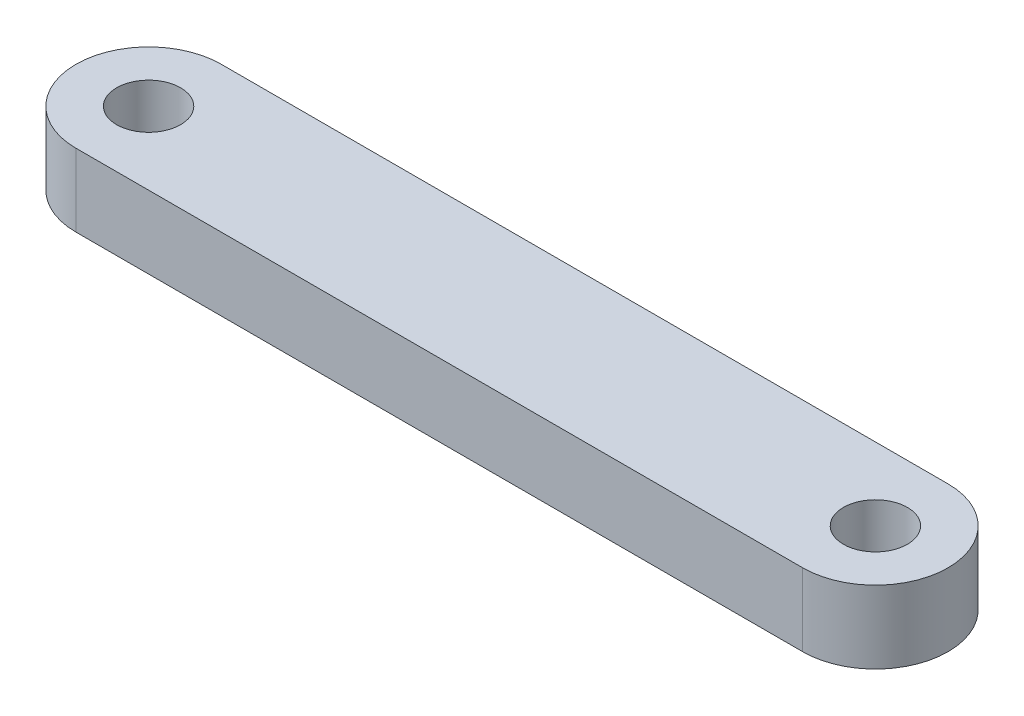
ISO-10303-21;
HEADER;
FILE_DESCRIPTION(('STEP AP214'),'2;1');
FILE_NAME('part.step','',(''),(''),'','','');
FILE_SCHEMA(('AUTOMOTIVE_DESIGN { 1 0 10303 214 1 1 1 1 }'));
ENDSEC;
DATA;
#1=APPLICATION_CONTEXT('core data for automotive mechanical design processes');
#2=APPLICATION_PROTOCOL_DEFINITION('international standard','automotive_design',2000,#1);
#3=PRODUCT_CONTEXT('',#1,'mechanical');
#4=PRODUCT('Part','Part','',(#3));
#5=PRODUCT_RELATED_PRODUCT_CATEGORY('part','',(#4));
#6=PRODUCT_DEFINITION_FORMATION('','',#4);
#7=PRODUCT_DEFINITION_CONTEXT('part definition',#1,'design');
#8=PRODUCT_DEFINITION('design','',#6,#7);
#9=PRODUCT_DEFINITION_SHAPE('','',#8);
#10=(LENGTH_UNIT() NAMED_UNIT(*) SI_UNIT(.MILLI.,.METRE.));
#11=(NAMED_UNIT(*) PLANE_ANGLE_UNIT() SI_UNIT($,.RADIAN.));
#12=(NAMED_UNIT(*) SI_UNIT($,.STERADIAN.) SOLID_ANGLE_UNIT());
#13=UNCERTAINTY_MEASURE_WITH_UNIT(LENGTH_MEASURE(1.E-05),#10,'distance_accuracy_value','');
#14=(GEOMETRIC_REPRESENTATION_CONTEXT(3) GLOBAL_UNCERTAINTY_ASSIGNED_CONTEXT((#13)) GLOBAL_UNIT_ASSIGNED_CONTEXT((#10,
#11,#12)) REPRESENTATION_CONTEXT('',''));
#15=CARTESIAN_POINT('',(0.,0.,0.));
#16=DIRECTION('',(0.,0.,1.));
#17=DIRECTION('',(1.,0.,0.));
#18=AXIS2_PLACEMENT_3D('',#15,#16,#17);
#19=CARTESIAN_POINT('',(0.,5.,0.));
#20=DIRECTION('',(0.,1.,0.));
#21=DIRECTION('',(0.,0.,1.));
#22=AXIS2_PLACEMENT_3D('',#19,#20,#21);
#23=PLANE('',#22);
#24=CARTESIAN_POINT('',(0.,5.,0.));
#25=DIRECTION('',(0.,1.,0.));
#26=DIRECTION('',(0.,0.,1.));
#27=AXIS2_PLACEMENT_3D('',#24,#25,#26);
#28=CIRCLE('',#27,2.2);
#29=CARTESIAN_POINT('',(0.,5.,2.2));
#30=VERTEX_POINT('',#29);
#31=EDGE_CURVE('E118',#30,#30,#28,.T.);
#32=ORIENTED_EDGE('',*,*,#31,.F.);
#33=EDGE_LOOP('',(#32));
#34=FACE_BOUND('',#33,.T.);
#35=CARTESIAN_POINT('',(0.,5.,0.));
#36=DIRECTION('',(0.,1.,0.));
#37=DIRECTION('',(0.,0.,1.));
#38=AXIS2_PLACEMENT_3D('',#35,#36,#37);
#39=CIRCLE('',#38,5.);
#40=CARTESIAN_POINT('',(0.,5.,-5.));
#41=VERTEX_POINT('',#40);
#42=CARTESIAN_POINT('',(0.,5.,5.));
#43=VERTEX_POINT('',#42);
#44=EDGE_CURVE('E98',#41,#43,#39,.T.);
#45=ORIENTED_EDGE('',*,*,#44,.T.);
#46=DIRECTION('',(1.,0.,0.));
#47=VECTOR('',#46,1.);
#48=CARTESIAN_POINT('',(0.,5.,5.));
#49=LINE('',#48,#47);
#50=CARTESIAN_POINT('',(50.,5.,5.));
#51=VERTEX_POINT('',#50);
#52=EDGE_CURVE('E93',#43,#51,#49,.T.);
#53=ORIENTED_EDGE('',*,*,#52,.T.);
#54=CARTESIAN_POINT('',(50.,5.,0.));
#55=DIRECTION('',(0.,1.,0.));
#56=DIRECTION('',(0.,0.,1.));
#57=AXIS2_PLACEMENT_3D('',#54,#55,#56);
#58=CIRCLE('',#57,5.);
#59=CARTESIAN_POINT('',(50.,5.,-5.));
#60=VERTEX_POINT('',#59);
#61=EDGE_CURVE('E96',#51,#60,#58,.T.);
#62=ORIENTED_EDGE('',*,*,#61,.T.);
#63=DIRECTION('',(-1.,0.,0.));
#64=VECTOR('',#63,1.);
#65=CARTESIAN_POINT('',(0.,5.,-5.));
#66=LINE('',#65,#64);
#67=EDGE_CURVE('E63',#60,#41,#66,.T.);
#68=ORIENTED_EDGE('',*,*,#67,.T.);
#69=EDGE_LOOP('',(#45,#53,#62,#68));
#70=FACE_BOUND('',#69,.T.);
#71=CARTESIAN_POINT('',(50.,5.,0.));
#72=DIRECTION('',(0.,1.,0.));
#73=DIRECTION('',(0.,0.,1.));
#74=AXIS2_PLACEMENT_3D('',#71,#72,#73);
#75=CIRCLE('',#74,2.2);
#76=CARTESIAN_POINT('',(50.,5.,2.2));
#77=VERTEX_POINT('',#76);
#78=EDGE_CURVE('E140',#77,#77,#75,.T.);
#79=ORIENTED_EDGE('',*,*,#78,.F.);
#80=EDGE_LOOP('',(#79));
#81=FACE_BOUND('',#80,.T.);
#82=ADVANCED_FACE('F45',(#34,#70,#81),#23,.T.);
#83=CARTESIAN_POINT('',(0.,0.,0.));
#84=DIRECTION('',(0.,1.,0.));
#85=DIRECTION('',(0.,0.,1.));
#86=AXIS2_PLACEMENT_3D('',#83,#84,#85);
#87=PLANE('',#86);
#88=CARTESIAN_POINT('',(0.,0.,0.));
#89=DIRECTION('',(0.,1.,0.));
#90=DIRECTION('',(0.,0.,1.));
#91=AXIS2_PLACEMENT_3D('',#88,#89,#90);
#92=CIRCLE('',#91,5.);
#93=CARTESIAN_POINT('',(0.,0.,-5.));
#94=VERTEX_POINT('',#93);
#95=CARTESIAN_POINT('',(0.,0.,5.));
#96=VERTEX_POINT('',#95);
#97=EDGE_CURVE('E114',#94,#96,#92,.T.);
#98=ORIENTED_EDGE('',*,*,#97,.F.);
#99=DIRECTION('',(-1.,0.,0.));
#100=VECTOR('',#99,1.);
#101=CARTESIAN_POINT('',(0.,0.,-5.));
#102=LINE('',#101,#100);
#103=CARTESIAN_POINT('',(50.,0.,-5.));
#104=VERTEX_POINT('',#103);
#105=EDGE_CURVE('E86',#104,#94,#102,.T.);
#106=ORIENTED_EDGE('',*,*,#105,.F.);
#107=CARTESIAN_POINT('',(50.,0.,0.));
#108=DIRECTION('',(0.,1.,0.));
#109=DIRECTION('',(0.,0.,1.));
#110=AXIS2_PLACEMENT_3D('',#107,#108,#109);
#111=CIRCLE('',#110,5.);
#112=CARTESIAN_POINT('',(50.,0.,5.));
#113=VERTEX_POINT('',#112);
#114=EDGE_CURVE('E80',#113,#104,#111,.T.);
#115=ORIENTED_EDGE('',*,*,#114,.F.);
#116=DIRECTION('',(1.,0.,0.));
#117=VECTOR('',#116,1.);
#118=CARTESIAN_POINT('',(0.,0.,5.));
#119=LINE('',#118,#117);
#120=EDGE_CURVE('E103',#96,#113,#119,.T.);
#121=ORIENTED_EDGE('',*,*,#120,.F.);
#122=EDGE_LOOP('',(#98,#106,#115,#121));
#123=FACE_BOUND('',#122,.T.);
#124=CARTESIAN_POINT('',(0.,0.,0.));
#125=DIRECTION('',(0.,1.,0.));
#126=DIRECTION('',(0.,0.,1.));
#127=AXIS2_PLACEMENT_3D('',#124,#125,#126);
#128=CIRCLE('',#127,2.2);
#129=CARTESIAN_POINT('',(0.,0.,2.2));
#130=VERTEX_POINT('',#129);
#131=EDGE_CURVE('E136',#130,#130,#128,.T.);
#132=ORIENTED_EDGE('',*,*,#131,.T.);
#133=EDGE_LOOP('',(#132));
#134=FACE_BOUND('',#133,.T.);
#135=CARTESIAN_POINT('',(50.,0.,0.));
#136=DIRECTION('',(0.,1.,0.));
#137=DIRECTION('',(0.,0.,1.));
#138=AXIS2_PLACEMENT_3D('',#135,#136,#137);
#139=CIRCLE('',#138,2.2);
#140=CARTESIAN_POINT('',(50.,0.,2.2));
#141=VERTEX_POINT('',#140);
#142=EDGE_CURVE('E144',#141,#141,#139,.T.);
#143=ORIENTED_EDGE('',*,*,#142,.T.);
#144=EDGE_LOOP('',(#143));
#145=FACE_BOUND('',#144,.T.);
#146=ADVANCED_FACE('F131',(#123,#134,#145),#87,.F.);
#147=CARTESIAN_POINT('',(0.,5.,0.));
#148=DIRECTION('',(0.,-1.,0.));
#149=DIRECTION('',(0.,0.,-1.));
#150=AXIS2_PLACEMENT_3D('',#147,#148,#149);
#151=CYLINDRICAL_SURFACE('',#150,5.);
#152=ORIENTED_EDGE('',*,*,#97,.T.);
#153=DIRECTION('',(0.,-1.,0.));
#154=VECTOR('',#153,1.);
#155=CARTESIAN_POINT('',(0.,5.,5.));
#156=LINE('',#155,#154);
#157=EDGE_CURVE('E11',#43,#96,#156,.T.);
#158=ORIENTED_EDGE('',*,*,#157,.F.);
#159=ORIENTED_EDGE('',*,*,#44,.F.);
#160=DIRECTION('',(0.,-1.,0.));
#161=VECTOR('',#160,1.);
#162=CARTESIAN_POINT('',(0.,5.,-5.));
#163=LINE('',#162,#161);
#164=EDGE_CURVE('E110',#41,#94,#163,.T.);
#165=ORIENTED_EDGE('',*,*,#164,.T.);
#166=EDGE_LOOP('',(#152,#158,#159,#165));
#167=FACE_BOUND('',#166,.T.);
#168=ADVANCED_FACE('F47',(#167),#151,.T.);
#169=CARTESIAN_POINT('',(0.,5.,5.));
#170=DIRECTION('',(0.,0.,-1.));
#171=DIRECTION('',(-1.,0.,0.));
#172=AXIS2_PLACEMENT_3D('',#169,#170,#171);
#173=PLANE('',#172);
#174=ORIENTED_EDGE('',*,*,#120,.T.);
#175=DIRECTION('',(0.,-1.,0.));
#176=VECTOR('',#175,1.);
#177=CARTESIAN_POINT('',(50.,5.,5.));
#178=LINE('',#177,#176);
#179=EDGE_CURVE('E55',#51,#113,#178,.T.);
#180=ORIENTED_EDGE('',*,*,#179,.F.);
#181=ORIENTED_EDGE('',*,*,#52,.F.);
#182=ORIENTED_EDGE('',*,*,#157,.T.);
#183=EDGE_LOOP('',(#174,#180,#181,#182));
#184=FACE_BOUND('',#183,.T.);
#185=ADVANCED_FACE('F102',(#184),#173,.F.);
#186=CARTESIAN_POINT('',(50.,5.,0.));
#187=DIRECTION('',(0.,-1.,0.));
#188=DIRECTION('',(0.,0.,-1.));
#189=AXIS2_PLACEMENT_3D('',#186,#187,#188);
#190=CYLINDRICAL_SURFACE('',#189,5.);
#191=ORIENTED_EDGE('',*,*,#114,.T.);
#192=DIRECTION('',(0.,-1.,0.));
#193=VECTOR('',#192,1.);
#194=CARTESIAN_POINT('',(50.,5.,-5.));
#195=LINE('',#194,#193);
#196=EDGE_CURVE('E105',#60,#104,#195,.T.);
#197=ORIENTED_EDGE('',*,*,#196,.F.);
#198=ORIENTED_EDGE('',*,*,#61,.F.);
#199=ORIENTED_EDGE('',*,*,#179,.T.);
#200=EDGE_LOOP('',(#191,#197,#198,#199));
#201=FACE_BOUND('',#200,.T.);
#202=ADVANCED_FACE('F106',(#201),#190,.T.);
#203=CARTESIAN_POINT('',(0.,5.,-5.));
#204=DIRECTION('',(0.,0.,1.));
#205=DIRECTION('',(1.,0.,0.));
#206=AXIS2_PLACEMENT_3D('',#203,#204,#205);
#207=PLANE('',#206);
#208=ORIENTED_EDGE('',*,*,#105,.T.);
#209=ORIENTED_EDGE('',*,*,#164,.F.);
#210=ORIENTED_EDGE('',*,*,#67,.F.);
#211=ORIENTED_EDGE('',*,*,#196,.T.);
#212=EDGE_LOOP('',(#208,#209,#210,#211));
#213=FACE_BOUND('',#212,.T.);
#214=ADVANCED_FACE('F128',(#213),#207,.F.);
#215=CARTESIAN_POINT('',(0.,5.,0.));
#216=DIRECTION('',(0.,-1.,0.));
#217=DIRECTION('',(0.,0.,-1.));
#218=AXIS2_PLACEMENT_3D('',#215,#216,#217);
#219=CYLINDRICAL_SURFACE('',#218,2.2);
#220=ORIENTED_EDGE('',*,*,#31,.T.);
#221=EDGE_LOOP('',(#220));
#222=FACE_BOUND('',#221,.T.);
#223=ORIENTED_EDGE('',*,*,#131,.F.);
#224=EDGE_LOOP('',(#223));
#225=FACE_BOUND('',#224,.T.);
#226=ADVANCED_FACE('F163',(#222,#225),#219,.F.);
#227=CARTESIAN_POINT('',(50.,5.,0.));
#228=DIRECTION('',(0.,-1.,0.));
#229=DIRECTION('',(0.,0.,-1.));
#230=AXIS2_PLACEMENT_3D('',#227,#228,#229);
#231=CYLINDRICAL_SURFACE('',#230,2.2);
#232=ORIENTED_EDGE('',*,*,#78,.T.);
#233=EDGE_LOOP('',(#232));
#234=FACE_BOUND('',#233,.T.);
#235=ORIENTED_EDGE('',*,*,#142,.F.);
#236=EDGE_LOOP('',(#235));
#237=FACE_BOUND('',#236,.T.);
#238=ADVANCED_FACE('F152',(#234,#237),#231,.F.);
#239=CLOSED_SHELL('',(#82,#146,#168,#185,#202,#214,#226,#238));
#240=MANIFOLD_SOLID_BREP('B2',#239);
#241=ADVANCED_BREP_SHAPE_REPRESENTATION('',(#18,#240),#14);
#242=SHAPE_DEFINITION_REPRESENTATION(#9,#241);
ENDSEC;
END-ISO-10303-21;
